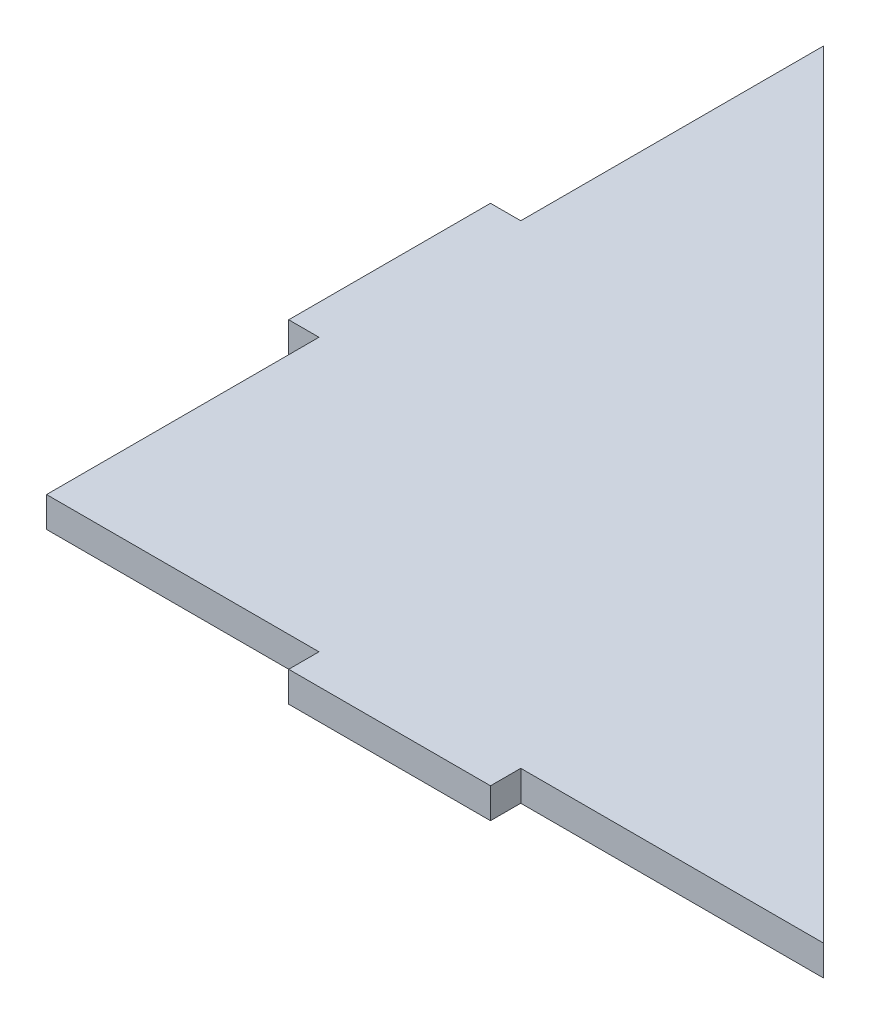
ISO-10303-21;
HEADER;
FILE_DESCRIPTION(('STEP AP214'),'2;1');
FILE_NAME('part.step','',(''),(''),'','','');
FILE_SCHEMA(('AUTOMOTIVE_DESIGN { 1 0 10303 214 1 1 1 1 }'));
ENDSEC;
DATA;
#1=APPLICATION_CONTEXT('core data for automotive mechanical design processes');
#2=APPLICATION_PROTOCOL_DEFINITION('international standard','automotive_design',2000,#1);
#3=PRODUCT_CONTEXT('',#1,'mechanical');
#4=PRODUCT('Part','Part','',(#3));
#5=PRODUCT_RELATED_PRODUCT_CATEGORY('part','',(#4));
#6=PRODUCT_DEFINITION_FORMATION('','',#4);
#7=PRODUCT_DEFINITION_CONTEXT('part definition',#1,'design');
#8=PRODUCT_DEFINITION('design','',#6,#7);
#9=PRODUCT_DEFINITION_SHAPE('','',#8);
#10=(LENGTH_UNIT() NAMED_UNIT(*) SI_UNIT(.MILLI.,.METRE.));
#11=(NAMED_UNIT(*) PLANE_ANGLE_UNIT() SI_UNIT($,.RADIAN.));
#12=(NAMED_UNIT(*) SI_UNIT($,.STERADIAN.) SOLID_ANGLE_UNIT());
#13=UNCERTAINTY_MEASURE_WITH_UNIT(LENGTH_MEASURE(1.E-05),#10,'distance_accuracy_value','');
#14=(GEOMETRIC_REPRESENTATION_CONTEXT(3) GLOBAL_UNCERTAINTY_ASSIGNED_CONTEXT((#13)) GLOBAL_UNIT_ASSIGNED_CONTEXT((#10,
#11,#12)) REPRESENTATION_CONTEXT('',''));
#15=CARTESIAN_POINT('',(0.,0.,0.));
#16=DIRECTION('',(0.,0.,1.));
#17=DIRECTION('',(1.,0.,0.));
#18=AXIS2_PLACEMENT_3D('',#15,#16,#17);
#19=CARTESIAN_POINT('',(0.,3.,0.));
#20=DIRECTION('',(1.,0.,0.));
#21=DIRECTION('',(0.,0.,-1.));
#22=AXIS2_PLACEMENT_3D('',#19,#20,#21);
#23=PLANE('',#22);
#24=DIRECTION('',(0.,0.,1.));
#25=VECTOR('',#24,1.);
#26=CARTESIAN_POINT('',(0.,0.,0.));
#27=LINE('',#26,#25);
#28=CARTESIAN_POINT('',(0.,0.,-27.));
#29=VERTEX_POINT('',#28);
#30=CARTESIAN_POINT('',(0.,0.,0.));
#31=VERTEX_POINT('',#30);
#32=EDGE_CURVE('E147',#29,#31,#27,.T.);
#33=ORIENTED_EDGE('',*,*,#32,.T.);
#34=DIRECTION('',(0.,-1.,0.));
#35=VECTOR('',#34,1.);
#36=CARTESIAN_POINT('',(0.,3.,0.));
#37=LINE('',#36,#35);
#38=CARTESIAN_POINT('',(0.,3.,0.));
#39=VERTEX_POINT('',#38);
#40=EDGE_CURVE('E11',#39,#31,#37,.T.);
#41=ORIENTED_EDGE('',*,*,#40,.F.);
#42=DIRECTION('',(0.,0.,1.));
#43=VECTOR('',#42,1.);
#44=CARTESIAN_POINT('',(0.,3.,0.));
#45=LINE('',#44,#43);
#46=CARTESIAN_POINT('',(0.,3.,-27.));
#47=VERTEX_POINT('',#46);
#48=EDGE_CURVE('E168',#47,#39,#45,.T.);
#49=ORIENTED_EDGE('',*,*,#48,.F.);
#50=DIRECTION('',(0.,-1.,0.));
#51=VECTOR('',#50,1.);
#52=CARTESIAN_POINT('',(0.,3.,-27.));
#53=LINE('',#52,#51);
#54=EDGE_CURVE('E143',#47,#29,#53,.T.);
#55=ORIENTED_EDGE('',*,*,#54,.T.);
#56=EDGE_LOOP('',(#33,#41,#49,#55));
#57=FACE_BOUND('',#56,.T.);
#58=ADVANCED_FACE('F33',(#57),#23,.F.);
#59=CARTESIAN_POINT('',(0.,3.,0.));
#60=DIRECTION('',(0.,0.,-1.));
#61=DIRECTION('',(-1.,0.,0.));
#62=AXIS2_PLACEMENT_3D('',#59,#60,#61);
#63=PLANE('',#62);
#64=DIRECTION('',(1.,0.,0.));
#65=VECTOR('',#64,1.);
#66=CARTESIAN_POINT('',(0.,0.,0.));
#67=LINE('',#66,#65);
#68=CARTESIAN_POINT('',(27.,0.,0.));
#69=VERTEX_POINT('',#68);
#70=EDGE_CURVE('E150',#31,#69,#67,.T.);
#71=ORIENTED_EDGE('',*,*,#70,.T.);
#72=DIRECTION('',(0.,-1.,0.));
#73=VECTOR('',#72,1.);
#74=CARTESIAN_POINT('',(27.,3.,0.));
#75=LINE('',#74,#73);
#76=CARTESIAN_POINT('',(27.,3.,0.));
#77=VERTEX_POINT('',#76);
#78=EDGE_CURVE('E41',#77,#69,#75,.T.);
#79=ORIENTED_EDGE('',*,*,#78,.F.);
#80=DIRECTION('',(1.,0.,0.));
#81=VECTOR('',#80,1.);
#82=CARTESIAN_POINT('',(0.,3.,0.));
#83=LINE('',#82,#81);
#84=EDGE_CURVE('E100',#39,#77,#83,.T.);
#85=ORIENTED_EDGE('',*,*,#84,.F.);
#86=ORIENTED_EDGE('',*,*,#40,.T.);
#87=EDGE_LOOP('',(#71,#79,#85,#86));
#88=FACE_BOUND('',#87,.T.);
#89=ADVANCED_FACE('F239',(#88),#63,.F.);
#90=CARTESIAN_POINT('',(27.,3.,3.));
#91=DIRECTION('',(1.,0.,0.));
#92=DIRECTION('',(0.,0.,-1.));
#93=AXIS2_PLACEMENT_3D('',#90,#91,#92);
#94=PLANE('',#93);
#95=DIRECTION('',(0.,0.,1.));
#96=VECTOR('',#95,1.);
#97=CARTESIAN_POINT('',(27.,0.,3.));
#98=LINE('',#97,#96);
#99=CARTESIAN_POINT('',(27.,0.,3.));
#100=VERTEX_POINT('',#99);
#101=EDGE_CURVE('E152',#69,#100,#98,.T.);
#102=ORIENTED_EDGE('',*,*,#101,.T.);
#103=DIRECTION('',(0.,-1.,0.));
#104=VECTOR('',#103,1.);
#105=CARTESIAN_POINT('',(27.,3.,3.));
#106=LINE('',#105,#104);
#107=CARTESIAN_POINT('',(27.,3.,3.));
#108=VERTEX_POINT('',#107);
#109=EDGE_CURVE('E184',#108,#100,#106,.T.);
#110=ORIENTED_EDGE('',*,*,#109,.F.);
#111=DIRECTION('',(0.,0.,1.));
#112=VECTOR('',#111,1.);
#113=CARTESIAN_POINT('',(27.,3.,3.));
#114=LINE('',#113,#112);
#115=EDGE_CURVE('E192',#77,#108,#114,.T.);
#116=ORIENTED_EDGE('',*,*,#115,.F.);
#117=ORIENTED_EDGE('',*,*,#78,.T.);
#118=EDGE_LOOP('',(#102,#110,#116,#117));
#119=FACE_BOUND('',#118,.T.);
#120=ADVANCED_FACE('F190',(#119),#94,.F.);
#121=CARTESIAN_POINT('',(37.,3.,3.));
#122=DIRECTION('',(0.,0.,-1.));
#123=DIRECTION('',(-1.,0.,0.));
#124=AXIS2_PLACEMENT_3D('',#121,#122,#123);
#125=PLANE('',#124);
#126=DIRECTION('',(1.,0.,0.));
#127=VECTOR('',#126,1.);
#128=CARTESIAN_POINT('',(37.,0.,3.));
#129=LINE('',#128,#127);
#130=CARTESIAN_POINT('',(47.,0.,3.));
#131=VERTEX_POINT('',#130);
#132=EDGE_CURVE('E155',#100,#131,#129,.T.);
#133=ORIENTED_EDGE('',*,*,#132,.T.);
#134=DIRECTION('',(0.,-1.,0.));
#135=VECTOR('',#134,1.);
#136=CARTESIAN_POINT('',(47.,3.,3.));
#137=LINE('',#136,#135);
#138=CARTESIAN_POINT('',(47.,3.,3.));
#139=VERTEX_POINT('',#138);
#140=EDGE_CURVE('E181',#139,#131,#137,.T.);
#141=ORIENTED_EDGE('',*,*,#140,.F.);
#142=DIRECTION('',(1.,0.,0.));
#143=VECTOR('',#142,1.);
#144=CARTESIAN_POINT('',(37.,3.,3.));
#145=LINE('',#144,#143);
#146=EDGE_CURVE('E209',#108,#139,#145,.T.);
#147=ORIENTED_EDGE('',*,*,#146,.F.);
#148=ORIENTED_EDGE('',*,*,#109,.T.);
#149=EDGE_LOOP('',(#133,#141,#147,#148));
#150=FACE_BOUND('',#149,.T.);
#151=ADVANCED_FACE('F200',(#150),#125,.F.);
#152=CARTESIAN_POINT('',(47.,3.,3.));
#153=DIRECTION('',(-1.,0.,0.));
#154=DIRECTION('',(0.,0.,1.));
#155=AXIS2_PLACEMENT_3D('',#152,#153,#154);
#156=PLANE('',#155);
#157=DIRECTION('',(0.,0.,-1.));
#158=VECTOR('',#157,1.);
#159=CARTESIAN_POINT('',(47.,0.,3.));
#160=LINE('',#159,#158);
#161=CARTESIAN_POINT('',(47.,0.,0.));
#162=VERTEX_POINT('',#161);
#163=EDGE_CURVE('E157',#131,#162,#160,.T.);
#164=ORIENTED_EDGE('',*,*,#163,.T.);
#165=DIRECTION('',(0.,-1.,0.));
#166=VECTOR('',#165,1.);
#167=CARTESIAN_POINT('',(47.,3.,0.));
#168=LINE('',#167,#166);
#169=CARTESIAN_POINT('',(47.,3.,0.));
#170=VERTEX_POINT('',#169);
#171=EDGE_CURVE('E178',#170,#162,#168,.T.);
#172=ORIENTED_EDGE('',*,*,#171,.F.);
#173=DIRECTION('',(0.,0.,-1.));
#174=VECTOR('',#173,1.);
#175=CARTESIAN_POINT('',(47.,3.,3.));
#176=LINE('',#175,#174);
#177=EDGE_CURVE('E206',#139,#170,#176,.T.);
#178=ORIENTED_EDGE('',*,*,#177,.F.);
#179=ORIENTED_EDGE('',*,*,#140,.T.);
#180=EDGE_LOOP('',(#164,#172,#178,#179));
#181=FACE_BOUND('',#180,.T.);
#182=ADVANCED_FACE('F204',(#181),#156,.F.);
#183=CARTESIAN_POINT('',(47.,3.,0.));
#184=DIRECTION('',(0.,0.,-1.));
#185=DIRECTION('',(-1.,0.,0.));
#186=AXIS2_PLACEMENT_3D('',#183,#184,#185);
#187=PLANE('',#186);
#188=DIRECTION('',(1.,0.,0.));
#189=VECTOR('',#188,1.);
#190=CARTESIAN_POINT('',(47.,0.,0.));
#191=LINE('',#190,#189);
#192=CARTESIAN_POINT('',(77.,0.,0.));
#193=VERTEX_POINT('',#192);
#194=EDGE_CURVE('E159',#162,#193,#191,.T.);
#195=ORIENTED_EDGE('',*,*,#194,.T.);
#196=DIRECTION('',(0.,-1.,0.));
#197=VECTOR('',#196,1.);
#198=CARTESIAN_POINT('',(77.,3.,0.));
#199=LINE('',#198,#197);
#200=CARTESIAN_POINT('',(77.,3.,0.));
#201=VERTEX_POINT('',#200);
#202=EDGE_CURVE('E175',#201,#193,#199,.T.);
#203=ORIENTED_EDGE('',*,*,#202,.F.);
#204=DIRECTION('',(1.,0.,0.));
#205=VECTOR('',#204,1.);
#206=CARTESIAN_POINT('',(47.,3.,0.));
#207=LINE('',#206,#205);
#208=EDGE_CURVE('E208',#170,#201,#207,.T.);
#209=ORIENTED_EDGE('',*,*,#208,.F.);
#210=ORIENTED_EDGE('',*,*,#171,.T.);
#211=EDGE_LOOP('',(#195,#203,#209,#210));
#212=FACE_BOUND('',#211,.T.);
#213=ADVANCED_FACE('F252',(#212),#187,.F.);
#214=CARTESIAN_POINT('',(0.,3.,-77.));
#215=DIRECTION('',(-0.707106781186548,0.,0.707106781186547));
#216=DIRECTION('',(0.707106781186547,0.,0.707106781186548));
#217=AXIS2_PLACEMENT_3D('',#214,#215,#216);
#218=PLANE('',#217);
#219=DIRECTION('',(-0.707106781186547,0.,-0.707106781186548));
#220=VECTOR('',#219,1.);
#221=CARTESIAN_POINT('',(0.,0.,-77.));
#222=LINE('',#221,#220);
#223=CARTESIAN_POINT('',(0.,0.,-77.));
#224=VERTEX_POINT('',#223);
#225=EDGE_CURVE('E161',#193,#224,#222,.T.);
#226=ORIENTED_EDGE('',*,*,#225,.T.);
#227=DIRECTION('',(0.,-1.,0.));
#228=VECTOR('',#227,1.);
#229=CARTESIAN_POINT('',(0.,3.,-77.));
#230=LINE('',#229,#228);
#231=CARTESIAN_POINT('',(0.,3.,-77.));
#232=VERTEX_POINT('',#231);
#233=EDGE_CURVE('E172',#232,#224,#230,.T.);
#234=ORIENTED_EDGE('',*,*,#233,.F.);
#235=DIRECTION('',(-0.707106781186547,0.,-0.707106781186548));
#236=VECTOR('',#235,1.);
#237=CARTESIAN_POINT('',(0.,3.,-77.));
#238=LINE('',#237,#236);
#239=EDGE_CURVE('E211',#201,#232,#238,.T.);
#240=ORIENTED_EDGE('',*,*,#239,.F.);
#241=ORIENTED_EDGE('',*,*,#202,.T.);
#242=EDGE_LOOP('',(#226,#234,#240,#241));
#243=FACE_BOUND('',#242,.T.);
#244=ADVANCED_FACE('F220',(#243),#218,.F.);
#245=CARTESIAN_POINT('',(0.,3.,-47.));
#246=DIRECTION('',(1.,0.,0.));
#247=DIRECTION('',(0.,0.,-1.));
#248=AXIS2_PLACEMENT_3D('',#245,#246,#247);
#249=PLANE('',#248);
#250=DIRECTION('',(0.,0.,1.));
#251=VECTOR('',#250,1.);
#252=CARTESIAN_POINT('',(0.,0.,-47.));
#253=LINE('',#252,#251);
#254=CARTESIAN_POINT('',(0.,0.,-47.));
#255=VERTEX_POINT('',#254);
#256=EDGE_CURVE('E163',#224,#255,#253,.T.);
#257=ORIENTED_EDGE('',*,*,#256,.T.);
#258=DIRECTION('',(0.,-1.,0.));
#259=VECTOR('',#258,1.);
#260=CARTESIAN_POINT('',(0.,3.,-47.));
#261=LINE('',#260,#259);
#262=CARTESIAN_POINT('',(0.,3.,-47.));
#263=VERTEX_POINT('',#262);
#264=EDGE_CURVE('E138',#263,#255,#261,.T.);
#265=ORIENTED_EDGE('',*,*,#264,.F.);
#266=DIRECTION('',(0.,0.,1.));
#267=VECTOR('',#266,1.);
#268=CARTESIAN_POINT('',(0.,3.,-47.));
#269=LINE('',#268,#267);
#270=EDGE_CURVE('E128',#232,#263,#269,.T.);
#271=ORIENTED_EDGE('',*,*,#270,.F.);
#272=ORIENTED_EDGE('',*,*,#233,.T.);
#273=EDGE_LOOP('',(#257,#265,#271,#272));
#274=FACE_BOUND('',#273,.T.);
#275=ADVANCED_FACE('F224',(#274),#249,.F.);
#276=CARTESIAN_POINT('',(-3.,3.,-47.));
#277=DIRECTION('',(0.,0.,1.));
#278=DIRECTION('',(1.,0.,0.));
#279=AXIS2_PLACEMENT_3D('',#276,#277,#278);
#280=PLANE('',#279);
#281=DIRECTION('',(-1.,0.,0.));
#282=VECTOR('',#281,1.);
#283=CARTESIAN_POINT('',(-3.,0.,-47.));
#284=LINE('',#283,#282);
#285=CARTESIAN_POINT('',(-3.,0.,-47.));
#286=VERTEX_POINT('',#285);
#287=EDGE_CURVE('E137',#255,#286,#284,.T.);
#288=ORIENTED_EDGE('',*,*,#287,.T.);
#289=DIRECTION('',(0.,-1.,0.));
#290=VECTOR('',#289,1.);
#291=CARTESIAN_POINT('',(-3.,3.,-47.));
#292=LINE('',#291,#290);
#293=CARTESIAN_POINT('',(-3.,3.,-47.));
#294=VERTEX_POINT('',#293);
#295=EDGE_CURVE('E134',#294,#286,#292,.T.);
#296=ORIENTED_EDGE('',*,*,#295,.F.);
#297=DIRECTION('',(-1.,0.,0.));
#298=VECTOR('',#297,1.);
#299=CARTESIAN_POINT('',(-3.,3.,-47.));
#300=LINE('',#299,#298);
#301=EDGE_CURVE('E122',#263,#294,#300,.T.);
#302=ORIENTED_EDGE('',*,*,#301,.F.);
#303=ORIENTED_EDGE('',*,*,#264,.T.);
#304=EDGE_LOOP('',(#288,#296,#302,#303));
#305=FACE_BOUND('',#304,.T.);
#306=ADVANCED_FACE('F135',(#305),#280,.F.);
#307=CARTESIAN_POINT('',(-3.,3.,-37.));
#308=DIRECTION('',(1.,0.,0.));
#309=DIRECTION('',(0.,0.,-1.));
#310=AXIS2_PLACEMENT_3D('',#307,#308,#309);
#311=PLANE('',#310);
#312=DIRECTION('',(0.,0.,1.));
#313=VECTOR('',#312,1.);
#314=CARTESIAN_POINT('',(-3.,0.,-37.));
#315=LINE('',#314,#313);
#316=CARTESIAN_POINT('',(-3.,0.,-27.));
#317=VERTEX_POINT('',#316);
#318=EDGE_CURVE('E86',#286,#317,#315,.T.);
#319=ORIENTED_EDGE('',*,*,#318,.T.);
#320=DIRECTION('',(0.,-1.,0.));
#321=VECTOR('',#320,1.);
#322=CARTESIAN_POINT('',(-3.,3.,-27.));
#323=LINE('',#322,#321);
#324=CARTESIAN_POINT('',(-3.,3.,-27.));
#325=VERTEX_POINT('',#324);
#326=EDGE_CURVE('E139',#325,#317,#323,.T.);
#327=ORIENTED_EDGE('',*,*,#326,.F.);
#328=DIRECTION('',(0.,0.,1.));
#329=VECTOR('',#328,1.);
#330=CARTESIAN_POINT('',(-3.,3.,-37.));
#331=LINE('',#330,#329);
#332=EDGE_CURVE('E126',#294,#325,#331,.T.);
#333=ORIENTED_EDGE('',*,*,#332,.F.);
#334=ORIENTED_EDGE('',*,*,#295,.T.);
#335=EDGE_LOOP('',(#319,#327,#333,#334));
#336=FACE_BOUND('',#335,.T.);
#337=ADVANCED_FACE('F141',(#336),#311,.F.);
#338=CARTESIAN_POINT('',(-3.,3.,-27.));
#339=DIRECTION('',(0.,0.,-1.));
#340=DIRECTION('',(-1.,0.,0.));
#341=AXIS2_PLACEMENT_3D('',#338,#339,#340);
#342=PLANE('',#341);
#343=DIRECTION('',(1.,0.,0.));
#344=VECTOR('',#343,1.);
#345=CARTESIAN_POINT('',(-3.,0.,-27.));
#346=LINE('',#345,#344);
#347=EDGE_CURVE('E92',#317,#29,#346,.T.);
#348=ORIENTED_EDGE('',*,*,#347,.T.);
#349=ORIENTED_EDGE('',*,*,#54,.F.);
#350=DIRECTION('',(1.,0.,0.));
#351=VECTOR('',#350,1.);
#352=CARTESIAN_POINT('',(-3.,3.,-27.));
#353=LINE('',#352,#351);
#354=EDGE_CURVE('E49',#325,#47,#353,.T.);
#355=ORIENTED_EDGE('',*,*,#354,.F.);
#356=ORIENTED_EDGE('',*,*,#326,.T.);
#357=EDGE_LOOP('',(#348,#349,#355,#356));
#358=FACE_BOUND('',#357,.T.);
#359=ADVANCED_FACE('F228',(#358),#342,.F.);
#360=CARTESIAN_POINT('',(0.,3.,0.));
#361=DIRECTION('',(0.,-1.,0.));
#362=DIRECTION('',(0.,0.,-1.));
#363=AXIS2_PLACEMENT_3D('',#360,#361,#362);
#364=PLANE('',#363);
#365=ORIENTED_EDGE('',*,*,#48,.T.);
#366=ORIENTED_EDGE('',*,*,#84,.T.);
#367=ORIENTED_EDGE('',*,*,#115,.T.);
#368=ORIENTED_EDGE('',*,*,#146,.T.);
#369=ORIENTED_EDGE('',*,*,#177,.T.);
#370=ORIENTED_EDGE('',*,*,#208,.T.);
#371=ORIENTED_EDGE('',*,*,#239,.T.);
#372=ORIENTED_EDGE('',*,*,#270,.T.);
#373=ORIENTED_EDGE('',*,*,#301,.T.);
#374=ORIENTED_EDGE('',*,*,#332,.T.);
#375=ORIENTED_EDGE('',*,*,#354,.T.);
#376=EDGE_LOOP('',(#365,#366,#367,#368,#369,#370,#371,#372,#373,#374,#375));
#377=FACE_BOUND('',#376,.T.);
#378=ADVANCED_FACE('F124',(#377),#364,.F.);
#379=CARTESIAN_POINT('',(0.,0.,0.));
#380=DIRECTION('',(0.,-1.,0.));
#381=DIRECTION('',(0.,0.,-1.));
#382=AXIS2_PLACEMENT_3D('',#379,#380,#381);
#383=PLANE('',#382);
#384=ORIENTED_EDGE('',*,*,#32,.F.);
#385=ORIENTED_EDGE('',*,*,#347,.F.);
#386=ORIENTED_EDGE('',*,*,#318,.F.);
#387=ORIENTED_EDGE('',*,*,#287,.F.);
#388=ORIENTED_EDGE('',*,*,#256,.F.);
#389=ORIENTED_EDGE('',*,*,#225,.F.);
#390=ORIENTED_EDGE('',*,*,#194,.F.);
#391=ORIENTED_EDGE('',*,*,#163,.F.);
#392=ORIENTED_EDGE('',*,*,#132,.F.);
#393=ORIENTED_EDGE('',*,*,#101,.F.);
#394=ORIENTED_EDGE('',*,*,#70,.F.);
#395=EDGE_LOOP('',(#384,#385,#386,#387,#388,#389,#390,#391,#392,#393,#394));
#396=FACE_BOUND('',#395,.T.);
#397=ADVANCED_FACE('F195',(#396),#383,.T.);
#398=CLOSED_SHELL('',(#58,#89,#120,#151,#182,#213,#244,#275,#306,#337,#359,#378,#397));
#399=MANIFOLD_SOLID_BREP('B2',#398);
#400=ADVANCED_BREP_SHAPE_REPRESENTATION('',(#18,#399),#14);
#401=SHAPE_DEFINITION_REPRESENTATION(#9,#400);
ENDSEC;
END-ISO-10303-21;
